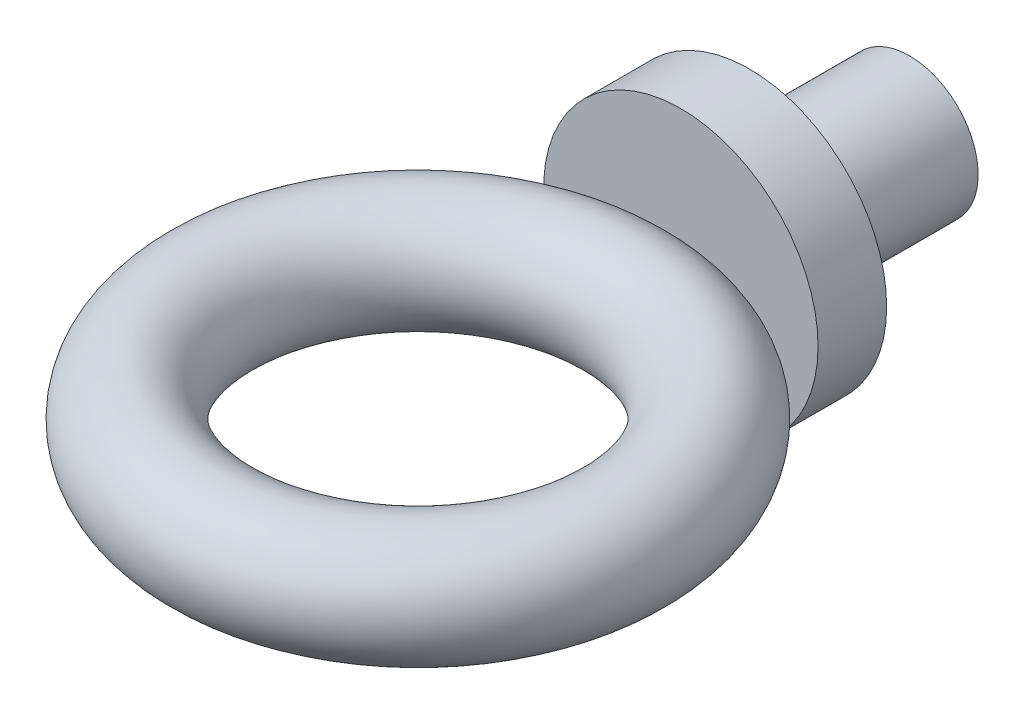
ISO-10303-21;
HEADER;
FILE_DESCRIPTION(('STEP AP214'),'2;1');
FILE_NAME('part.step','',(''),(''),'','','');
FILE_SCHEMA(('AUTOMOTIVE_DESIGN { 1 0 10303 214 1 1 1 1 }'));
ENDSEC;
DATA;
#1=APPLICATION_CONTEXT('core data for automotive mechanical design processes');
#2=APPLICATION_PROTOCOL_DEFINITION('international standard','automotive_design',2000,#1);
#3=PRODUCT_CONTEXT('',#1,'mechanical');
#4=PRODUCT('Part','Part','',(#3));
#5=PRODUCT_RELATED_PRODUCT_CATEGORY('part','',(#4));
#6=PRODUCT_DEFINITION_FORMATION('','',#4);
#7=PRODUCT_DEFINITION_CONTEXT('part definition',#1,'design');
#8=PRODUCT_DEFINITION('design','',#6,#7);
#9=PRODUCT_DEFINITION_SHAPE('','',#8);
#10=(LENGTH_UNIT() NAMED_UNIT(*) SI_UNIT(.MILLI.,.METRE.));
#11=(NAMED_UNIT(*) PLANE_ANGLE_UNIT() SI_UNIT($,.RADIAN.));
#12=(NAMED_UNIT(*) SI_UNIT($,.STERADIAN.) SOLID_ANGLE_UNIT());
#13=UNCERTAINTY_MEASURE_WITH_UNIT(LENGTH_MEASURE(1.E-05),#10,'distance_accuracy_value','');
#14=(GEOMETRIC_REPRESENTATION_CONTEXT(3) GLOBAL_UNCERTAINTY_ASSIGNED_CONTEXT((#13)) GLOBAL_UNIT_ASSIGNED_CONTEXT((#10,
#11,#12)) REPRESENTATION_CONTEXT('',''));
#15=CARTESIAN_POINT('',(0.,0.,0.));
#16=DIRECTION('',(0.,0.,1.));
#17=DIRECTION('',(1.,0.,0.));
#18=AXIS2_PLACEMENT_3D('',#15,#16,#17);
#19=CARTESIAN_POINT('',(0.,0.,29.));
#20=DIRECTION('',(0.,1.,0.));
#21=DIRECTION('',(-1.,0.,0.));
#22=AXIS2_PLACEMENT_3D('',#19,#20,#21);
#23=TOROIDAL_SURFACE('',#22,18.,5.00000000000001);
#24=CARTESIAN_POINT('',(-23.,0.,29.));
#25=VERTEX_POINT('',#24);
#26=VERTEX_LOOP('',#25);
#27=FACE_BOUND('',#26,.T.);
#28=ADVANCED_FACE('F42',(#27),#23,.T.);
#29=CLOSED_SHELL('',(#28));
#30=MANIFOLD_SOLID_BREP('B2',#29);
#31=CARTESIAN_POINT('',(0.,0.,6.));
#32=DIRECTION('',(0.,0.,-1.));
#33=DIRECTION('',(-1.,0.,0.));
#34=AXIS2_PLACEMENT_3D('',#31,#32,#33);
#35=CYLINDRICAL_SURFACE('',#34,12.);
#36=CARTESIAN_POINT('',(0.,0.,6.));
#37=DIRECTION('',(0.,0.,1.));
#38=DIRECTION('',(1.,0.,0.));
#39=AXIS2_PLACEMENT_3D('',#36,#37,#38);
#40=CIRCLE('',#39,12.);
#41=CARTESIAN_POINT('',(12.,0.,6.));
#42=VERTEX_POINT('',#41);
#43=EDGE_CURVE('E43',#42,#42,#40,.T.);
#44=ORIENTED_EDGE('',*,*,#43,.F.);
#45=EDGE_LOOP('',(#44));
#46=FACE_BOUND('',#45,.T.);
#47=CARTESIAN_POINT('',(0.,0.,0.));
#48=DIRECTION('',(0.,0.,1.));
#49=DIRECTION('',(1.,0.,0.));
#50=AXIS2_PLACEMENT_3D('',#47,#48,#49);
#51=CIRCLE('',#50,12.);
#52=CARTESIAN_POINT('',(12.,0.,0.));
#53=VERTEX_POINT('',#52);
#54=EDGE_CURVE('E67',#53,#53,#51,.T.);
#55=ORIENTED_EDGE('',*,*,#54,.T.);
#56=EDGE_LOOP('',(#55));
#57=FACE_BOUND('',#56,.T.);
#58=ADVANCED_FACE('F63',(#46,#57),#35,.T.);
#59=CARTESIAN_POINT('',(0.,0.,6.));
#60=DIRECTION('',(0.,0.,1.));
#61=DIRECTION('',(1.,0.,0.));
#62=AXIS2_PLACEMENT_3D('',#59,#60,#61);
#63=PLANE('',#62);
#64=ORIENTED_EDGE('',*,*,#43,.T.);
#65=EDGE_LOOP('',(#64));
#66=FACE_BOUND('',#65,.T.);
#67=ADVANCED_FACE('F78',(#66),#63,.T.);
#68=CARTESIAN_POINT('',(0.,0.,0.));
#69=DIRECTION('',(0.,0.,1.));
#70=DIRECTION('',(1.,0.,0.));
#71=AXIS2_PLACEMENT_3D('',#68,#69,#70);
#72=PLANE('',#71);
#73=ORIENTED_EDGE('',*,*,#54,.F.);
#74=EDGE_LOOP('',(#73));
#75=FACE_BOUND('',#74,.T.);
#76=ADVANCED_FACE('F76',(#75),#72,.F.);
#77=CLOSED_SHELL('',(#58,#67,#76));
#78=MANIFOLD_SOLID_BREP('B6',#77);
#79=CARTESIAN_POINT('',(0.,0.,0.5));
#80=DIRECTION('',(0.,0.,-1.));
#81=DIRECTION('',(-1.,0.,0.));
#82=AXIS2_PLACEMENT_3D('',#79,#80,#81);
#83=CYLINDRICAL_SURFACE('',#82,6.);
#84=CARTESIAN_POINT('',(0.,0.,0.5));
#85=DIRECTION('',(0.,0.,1.));
#86=DIRECTION('',(1.,0.,0.));
#87=AXIS2_PLACEMENT_3D('',#84,#85,#86);
#88=CIRCLE('',#87,6.);
#89=CARTESIAN_POINT('',(-6.,0.,0.5));
#90=VERTEX_POINT('',#89);
#91=EDGE_CURVE('E65',#90,#90,#88,.T.);
#92=CARTESIAN_POINT('',(0.,0.,-14.));
#93=DIRECTION('',(0.,0.,1.));
#94=DIRECTION('',(1.,0.,0.));
#95=AXIS2_PLACEMENT_3D('',#92,#93,#94);
#96=CIRCLE('',#95,6.);
#97=CARTESIAN_POINT('',(-6.,0.,-14.));
#98=VERTEX_POINT('',#97);
#99=EDGE_CURVE('E107',#98,#98,#96,.T.);
#100=CARTESIAN_POINT('',(-6.,0.,0.5));
#101=CARTESIAN_POINT('',(-6.,0.,0.348958333333334));
#102=CARTESIAN_POINT('',(-6.,0.,0.197916666666667));
#103=CARTESIAN_POINT('',(-6.,0.,-0.104166666666666));
#104=CARTESIAN_POINT('',(-6.,0.,-0.255208333333333));
#105=CARTESIAN_POINT('',(-6.,0.,-0.557291666666666));
#106=CARTESIAN_POINT('',(-6.,0.,-0.708333333333333));
#107=CARTESIAN_POINT('',(-6.,0.,-1.01041666666667));
#108=CARTESIAN_POINT('',(-6.,0.,-1.16145833333333));
#109=CARTESIAN_POINT('',(-6.,0.,-1.46354166666667));
#110=CARTESIAN_POINT('',(-6.,0.,-1.61458333333333));
#111=CARTESIAN_POINT('',(-6.,0.,-1.91666666666667));
#112=CARTESIAN_POINT('',(-6.,0.,-2.06770833333333));
#113=CARTESIAN_POINT('',(-6.,0.,-2.36979166666667));
#114=CARTESIAN_POINT('',(-6.,0.,-2.52083333333333));
#115=CARTESIAN_POINT('',(-6.,0.,-2.82291666666667));
#116=CARTESIAN_POINT('',(-6.,0.,-2.97395833333333));
#117=CARTESIAN_POINT('',(-6.,0.,-3.27604166666667));
#118=CARTESIAN_POINT('',(-6.,0.,-3.42708333333333));
#119=CARTESIAN_POINT('',(-6.,0.,-3.72916666666667));
#120=CARTESIAN_POINT('',(-6.,0.,-3.88020833333333));
#121=CARTESIAN_POINT('',(-6.,0.,-4.18229166666667));
#122=CARTESIAN_POINT('',(-6.,0.,-4.33333333333333));
#123=CARTESIAN_POINT('',(-6.,0.,-4.63541666666667));
#124=CARTESIAN_POINT('',(-6.,0.,-4.78645833333333));
#125=CARTESIAN_POINT('',(-6.,0.,-5.08854166666667));
#126=CARTESIAN_POINT('',(-6.,0.,-5.23958333333333));
#127=CARTESIAN_POINT('',(-6.,0.,-5.54166666666667));
#128=CARTESIAN_POINT('',(-6.,0.,-5.69270833333333));
#129=CARTESIAN_POINT('',(-6.,0.,-5.99479166666667));
#130=CARTESIAN_POINT('',(-6.,0.,-6.14583333333333));
#131=CARTESIAN_POINT('',(-6.,0.,-6.44791666666667));
#132=CARTESIAN_POINT('',(-6.,0.,-6.59895833333333));
#133=CARTESIAN_POINT('',(-6.,0.,-6.90104166666667));
#134=CARTESIAN_POINT('',(-6.,0.,-7.05208333333333));
#135=CARTESIAN_POINT('',(-6.,0.,-7.35416666666667));
#136=CARTESIAN_POINT('',(-6.,0.,-7.50520833333333));
#137=CARTESIAN_POINT('',(-6.,0.,-7.80729166666667));
#138=CARTESIAN_POINT('',(-6.,0.,-7.95833333333333));
#139=CARTESIAN_POINT('',(-6.,0.,-8.26041666666667));
#140=CARTESIAN_POINT('',(-6.,0.,-8.41145833333333));
#141=CARTESIAN_POINT('',(-6.,0.,-8.71354166666667));
#142=CARTESIAN_POINT('',(-6.,0.,-8.86458333333333));
#143=CARTESIAN_POINT('',(-6.,0.,-9.16666666666667));
#144=CARTESIAN_POINT('',(-6.,0.,-9.31770833333333));
#145=CARTESIAN_POINT('',(-6.,0.,-9.61979166666667));
#146=CARTESIAN_POINT('',(-6.,0.,-9.77083333333333));
#147=CARTESIAN_POINT('',(-6.,0.,-10.0729166666667));
#148=CARTESIAN_POINT('',(-6.,0.,-10.2239583333333));
#149=CARTESIAN_POINT('',(-6.,0.,-10.5260416666667));
#150=CARTESIAN_POINT('',(-6.,0.,-10.6770833333333));
#151=CARTESIAN_POINT('',(-6.,0.,-10.9791666666667));
#152=CARTESIAN_POINT('',(-6.,0.,-11.1302083333333));
#153=CARTESIAN_POINT('',(-6.,0.,-11.4322916666667));
#154=CARTESIAN_POINT('',(-6.,0.,-11.5833333333333));
#155=CARTESIAN_POINT('',(-6.,0.,-11.8854166666667));
#156=CARTESIAN_POINT('',(-6.,0.,-12.0364583333333));
#157=CARTESIAN_POINT('',(-6.,0.,-12.3385416666667));
#158=CARTESIAN_POINT('',(-6.,0.,-12.4895833333333));
#159=CARTESIAN_POINT('',(-6.,0.,-12.7916666666667));
#160=CARTESIAN_POINT('',(-6.,0.,-12.9427083333333));
#161=CARTESIAN_POINT('',(-6.,0.,-13.2447916666667));
#162=CARTESIAN_POINT('',(-6.,0.,-13.3958333333333));
#163=CARTESIAN_POINT('',(-6.,0.,-13.6979166666667));
#164=CARTESIAN_POINT('',(-6.,0.,-13.8489583333333));
#165=CARTESIAN_POINT('',(-6.,0.,-14.));
#166=B_SPLINE_CURVE_WITH_KNOTS('',3,(#100,#101,#102,#103,#104,#105,#106,#107,#108,#109,#110,
#111,#112,#113,#114,#115,#116,#117,#118,#119,#120,#121,#122,#123,#124,#125,#126,#127,#128,#129,
#130,#131,#132,#133,#134,#135,#136,#137,#138,#139,#140,#141,#142,#143,#144,#145,#146,#147,#148,
#149,#150,#151,#152,#153,#154,#155,#156,#157,#158,#159,#160,#161,#162,#163,#164,#165),
.UNSPECIFIED.,.F.,.F.,(4,2,2,2,2,2,2,2,2,2,2,2,2,2,2,2,2,2,2,2,2,2,2,2,2,2,2,2,2,2,2,2,4),(0.,
0.453125,0.90625,1.359375,1.8125,2.265625,2.71875,3.171875,3.625,4.078125,4.53125,4.984375,
5.4375,5.890625,6.34375,6.796875,7.25,7.703125,8.15625,8.609375,9.0625,9.515625,9.96875,
10.421875,10.875,11.328125,11.78125,12.234375,12.6875,13.140625,13.59375,14.046875,14.5),.UNSPECIFIED.);
#167=EDGE_CURVE('BSEAM104',#90,#98,#166,.T.);
#168=ORIENTED_EDGE('',*,*,#91,.F.);
#169=ORIENTED_EDGE('',*,*,#99,.T.);
#170=ORIENTED_EDGE('',*,*,#167,.T.);
#171=ORIENTED_EDGE('',*,*,#167,.F.);
#172=EDGE_LOOP('',(#168,#170,#169,#171));
#173=FACE_BOUND('',#172,.T.);
#174=ADVANCED_FACE('F104',(#173),#83,.T.);
#175=CARTESIAN_POINT('',(0.,0.,0.5));
#176=DIRECTION('',(0.,0.,1.));
#177=DIRECTION('',(1.,0.,0.));
#178=AXIS2_PLACEMENT_3D('',#175,#176,#177);
#179=PLANE('',#178);
#180=ORIENTED_EDGE('',*,*,#91,.T.);
#181=EDGE_LOOP('',(#180));
#182=FACE_BOUND('',#181,.T.);
#183=ADVANCED_FACE('F117',(#182),#179,.T.);
#184=CARTESIAN_POINT('',(0.,0.,-14.));
#185=DIRECTION('',(0.,0.,1.));
#186=DIRECTION('',(1.,0.,0.));
#187=AXIS2_PLACEMENT_3D('',#184,#185,#186);
#188=PLANE('',#187);
#189=ORIENTED_EDGE('',*,*,#99,.F.);
#190=EDGE_LOOP('',(#189));
#191=FACE_BOUND('',#190,.T.);
#192=ADVANCED_FACE('F120',(#191),#188,.F.);
#193=CLOSED_SHELL('',(#174,#183,#192));
#194=MANIFOLD_SOLID_BREP('B36',#193);
#195=ADVANCED_BREP_SHAPE_REPRESENTATION('',(#18,#30,#78,#194),#14);
#196=SHAPE_DEFINITION_REPRESENTATION(#9,#195);
ENDSEC;
END-ISO-10303-21;
